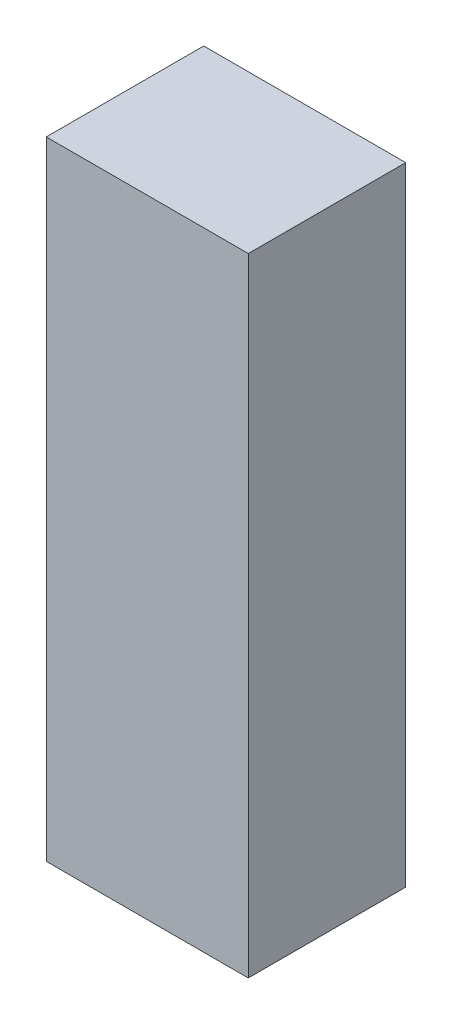
ISO-10303-21;
HEADER;
FILE_DESCRIPTION(('STEP AP214'),'2;1');
FILE_NAME('part.step','',(''),(''),'','','');
FILE_SCHEMA(('AUTOMOTIVE_DESIGN { 1 0 10303 214 1 1 1 1 }'));
ENDSEC;
DATA;
#1=APPLICATION_CONTEXT('core data for automotive mechanical design processes');
#2=APPLICATION_PROTOCOL_DEFINITION('international standard','automotive_design',2000,#1);
#3=PRODUCT_CONTEXT('',#1,'mechanical');
#4=PRODUCT('Part','Part','',(#3));
#5=PRODUCT_RELATED_PRODUCT_CATEGORY('part','',(#4));
#6=PRODUCT_DEFINITION_FORMATION('','',#4);
#7=PRODUCT_DEFINITION_CONTEXT('part definition',#1,'design');
#8=PRODUCT_DEFINITION('design','',#6,#7);
#9=PRODUCT_DEFINITION_SHAPE('','',#8);
#10=(LENGTH_UNIT() NAMED_UNIT(*) SI_UNIT(.MILLI.,.METRE.));
#11=(NAMED_UNIT(*) PLANE_ANGLE_UNIT() SI_UNIT($,.RADIAN.));
#12=(NAMED_UNIT(*) SI_UNIT($,.STERADIAN.) SOLID_ANGLE_UNIT());
#13=UNCERTAINTY_MEASURE_WITH_UNIT(LENGTH_MEASURE(1.E-05),#10,'distance_accuracy_value','');
#14=(GEOMETRIC_REPRESENTATION_CONTEXT(3) GLOBAL_UNCERTAINTY_ASSIGNED_CONTEXT((#13)) GLOBAL_UNIT_ASSIGNED_CONTEXT((#10,
#11,#12)) REPRESENTATION_CONTEXT('',''));
#15=CARTESIAN_POINT('',(0.,0.,0.));
#16=DIRECTION('',(0.,0.,1.));
#17=DIRECTION('',(1.,0.,0.));
#18=AXIS2_PLACEMENT_3D('',#15,#16,#17);
#19=CARTESIAN_POINT('',(-17.,52.8,26.5));
#20=DIRECTION('',(1.,0.,0.));
#21=DIRECTION('',(0.,1.,0.));
#22=AXIS2_PLACEMENT_3D('',#19,#20,#21);
#23=PLANE('',#22);
#24=DIRECTION('',(0.,-1.,0.));
#25=VECTOR('',#24,1.);
#26=CARTESIAN_POINT('',(-17.,52.8,0.));
#27=LINE('',#26,#25);
#28=CARTESIAN_POINT('',(-17.,52.8,0.));
#29=VERTEX_POINT('',#28);
#30=CARTESIAN_POINT('',(-17.,-52.8,0.));
#31=VERTEX_POINT('',#30);
#32=EDGE_CURVE('E100',#29,#31,#27,.T.);
#33=ORIENTED_EDGE('',*,*,#32,.T.);
#34=DIRECTION('',(0.,0.,-1.));
#35=VECTOR('',#34,1.);
#36=CARTESIAN_POINT('',(-17.,-52.8,26.5));
#37=LINE('',#36,#35);
#38=CARTESIAN_POINT('',(-17.,-52.8,26.5));
#39=VERTEX_POINT('',#38);
#40=EDGE_CURVE('E11',#39,#31,#37,.T.);
#41=ORIENTED_EDGE('',*,*,#40,.F.);
#42=DIRECTION('',(0.,-1.,0.));
#43=VECTOR('',#42,1.);
#44=CARTESIAN_POINT('',(-17.,52.8,26.5));
#45=LINE('',#44,#43);
#46=CARTESIAN_POINT('',(-17.,52.8,26.5));
#47=VERTEX_POINT('',#46);
#48=EDGE_CURVE('E88',#47,#39,#45,.T.);
#49=ORIENTED_EDGE('',*,*,#48,.F.);
#50=DIRECTION('',(0.,0.,-1.));
#51=VECTOR('',#50,1.);
#52=CARTESIAN_POINT('',(-17.,52.8,26.5));
#53=LINE('',#52,#51);
#54=EDGE_CURVE('E96',#47,#29,#53,.T.);
#55=ORIENTED_EDGE('',*,*,#54,.T.);
#56=EDGE_LOOP('',(#33,#41,#49,#55));
#57=FACE_BOUND('',#56,.T.);
#58=ADVANCED_FACE('F37',(#57),#23,.F.);
#59=CARTESIAN_POINT('',(17.,-52.8,26.5));
#60=DIRECTION('',(0.,1.,0.));
#61=DIRECTION('',(0.,0.,1.));
#62=AXIS2_PLACEMENT_3D('',#59,#60,#61);
#63=PLANE('',#62);
#64=DIRECTION('',(1.,0.,0.));
#65=VECTOR('',#64,1.);
#66=CARTESIAN_POINT('',(17.,-52.8,0.));
#67=LINE('',#66,#65);
#68=CARTESIAN_POINT('',(17.,-52.8,0.));
#69=VERTEX_POINT('',#68);
#70=EDGE_CURVE('E92',#31,#69,#67,.T.);
#71=ORIENTED_EDGE('',*,*,#70,.T.);
#72=DIRECTION('',(0.,0.,-1.));
#73=VECTOR('',#72,1.);
#74=CARTESIAN_POINT('',(17.,-52.8,26.5));
#75=LINE('',#74,#73);
#76=CARTESIAN_POINT('',(17.,-52.8,26.5));
#77=VERTEX_POINT('',#76);
#78=EDGE_CURVE('E45',#77,#69,#75,.T.);
#79=ORIENTED_EDGE('',*,*,#78,.F.);
#80=DIRECTION('',(1.,0.,0.));
#81=VECTOR('',#80,1.);
#82=CARTESIAN_POINT('',(17.,-52.8,26.5));
#83=LINE('',#82,#81);
#84=EDGE_CURVE('E83',#39,#77,#83,.T.);
#85=ORIENTED_EDGE('',*,*,#84,.F.);
#86=ORIENTED_EDGE('',*,*,#40,.T.);
#87=EDGE_LOOP('',(#71,#79,#85,#86));
#88=FACE_BOUND('',#87,.T.);
#89=ADVANCED_FACE('F91',(#88),#63,.F.);
#90=CARTESIAN_POINT('',(17.,52.8,26.5));
#91=DIRECTION('',(-1.,0.,0.));
#92=DIRECTION('',(0.,-1.,0.));
#93=AXIS2_PLACEMENT_3D('',#90,#91,#92);
#94=PLANE('',#93);
#95=DIRECTION('',(0.,1.,0.));
#96=VECTOR('',#95,1.);
#97=CARTESIAN_POINT('',(17.,52.8,0.));
#98=LINE('',#97,#96);
#99=CARTESIAN_POINT('',(17.,52.8,0.));
#100=VERTEX_POINT('',#99);
#101=EDGE_CURVE('E70',#69,#100,#98,.T.);
#102=ORIENTED_EDGE('',*,*,#101,.T.);
#103=DIRECTION('',(0.,0.,-1.));
#104=VECTOR('',#103,1.);
#105=CARTESIAN_POINT('',(17.,52.8,26.5));
#106=LINE('',#105,#104);
#107=CARTESIAN_POINT('',(17.,52.8,26.5));
#108=VERTEX_POINT('',#107);
#109=EDGE_CURVE('E93',#108,#100,#106,.T.);
#110=ORIENTED_EDGE('',*,*,#109,.F.);
#111=DIRECTION('',(0.,1.,0.));
#112=VECTOR('',#111,1.);
#113=CARTESIAN_POINT('',(17.,52.8,26.5));
#114=LINE('',#113,#112);
#115=EDGE_CURVE('E86',#77,#108,#114,.T.);
#116=ORIENTED_EDGE('',*,*,#115,.F.);
#117=ORIENTED_EDGE('',*,*,#78,.T.);
#118=EDGE_LOOP('',(#102,#110,#116,#117));
#119=FACE_BOUND('',#118,.T.);
#120=ADVANCED_FACE('F94',(#119),#94,.F.);
#121=CARTESIAN_POINT('',(17.,52.8,26.5));
#122=DIRECTION('',(0.,-1.,0.));
#123=DIRECTION('',(0.,0.,-1.));
#124=AXIS2_PLACEMENT_3D('',#121,#122,#123);
#125=PLANE('',#124);
#126=DIRECTION('',(-1.,0.,0.));
#127=VECTOR('',#126,1.);
#128=CARTESIAN_POINT('',(17.,52.8,0.));
#129=LINE('',#128,#127);
#130=EDGE_CURVE('E76',#100,#29,#129,.T.);
#131=ORIENTED_EDGE('',*,*,#130,.T.);
#132=ORIENTED_EDGE('',*,*,#54,.F.);
#133=DIRECTION('',(-1.,0.,0.));
#134=VECTOR('',#133,1.);
#135=CARTESIAN_POINT('',(17.,52.8,26.5));
#136=LINE('',#135,#134);
#137=EDGE_CURVE('E53',#108,#47,#136,.T.);
#138=ORIENTED_EDGE('',*,*,#137,.F.);
#139=ORIENTED_EDGE('',*,*,#109,.T.);
#140=EDGE_LOOP('',(#131,#132,#138,#139));
#141=FACE_BOUND('',#140,.T.);
#142=ADVANCED_FACE('F107',(#141),#125,.F.);
#143=CARTESIAN_POINT('',(0.,0.,26.5));
#144=DIRECTION('',(0.,0.,-1.));
#145=DIRECTION('',(-1.,0.,0.));
#146=AXIS2_PLACEMENT_3D('',#143,#144,#145);
#147=PLANE('',#146);
#148=ORIENTED_EDGE('',*,*,#48,.T.);
#149=ORIENTED_EDGE('',*,*,#84,.T.);
#150=ORIENTED_EDGE('',*,*,#115,.T.);
#151=ORIENTED_EDGE('',*,*,#137,.T.);
#152=EDGE_LOOP('',(#148,#149,#150,#151));
#153=FACE_BOUND('',#152,.T.);
#154=ADVANCED_FACE('F84',(#153),#147,.F.);
#155=CARTESIAN_POINT('',(0.,0.,0.));
#156=DIRECTION('',(0.,0.,-1.));
#157=DIRECTION('',(-1.,0.,0.));
#158=AXIS2_PLACEMENT_3D('',#155,#156,#157);
#159=PLANE('',#158);
#160=ORIENTED_EDGE('',*,*,#32,.F.);
#161=ORIENTED_EDGE('',*,*,#130,.F.);
#162=ORIENTED_EDGE('',*,*,#101,.F.);
#163=ORIENTED_EDGE('',*,*,#70,.F.);
#164=EDGE_LOOP('',(#160,#161,#162,#163));
#165=FACE_BOUND('',#164,.T.);
#166=ADVANCED_FACE('F110',(#165),#159,.T.);
#167=CLOSED_SHELL('',(#58,#89,#120,#142,#154,#166));
#168=MANIFOLD_SOLID_BREP('B2',#167);
#169=ADVANCED_BREP_SHAPE_REPRESENTATION('',(#18,#168),#14);
#170=SHAPE_DEFINITION_REPRESENTATION(#9,#169);
ENDSEC;
END-ISO-10303-21;
